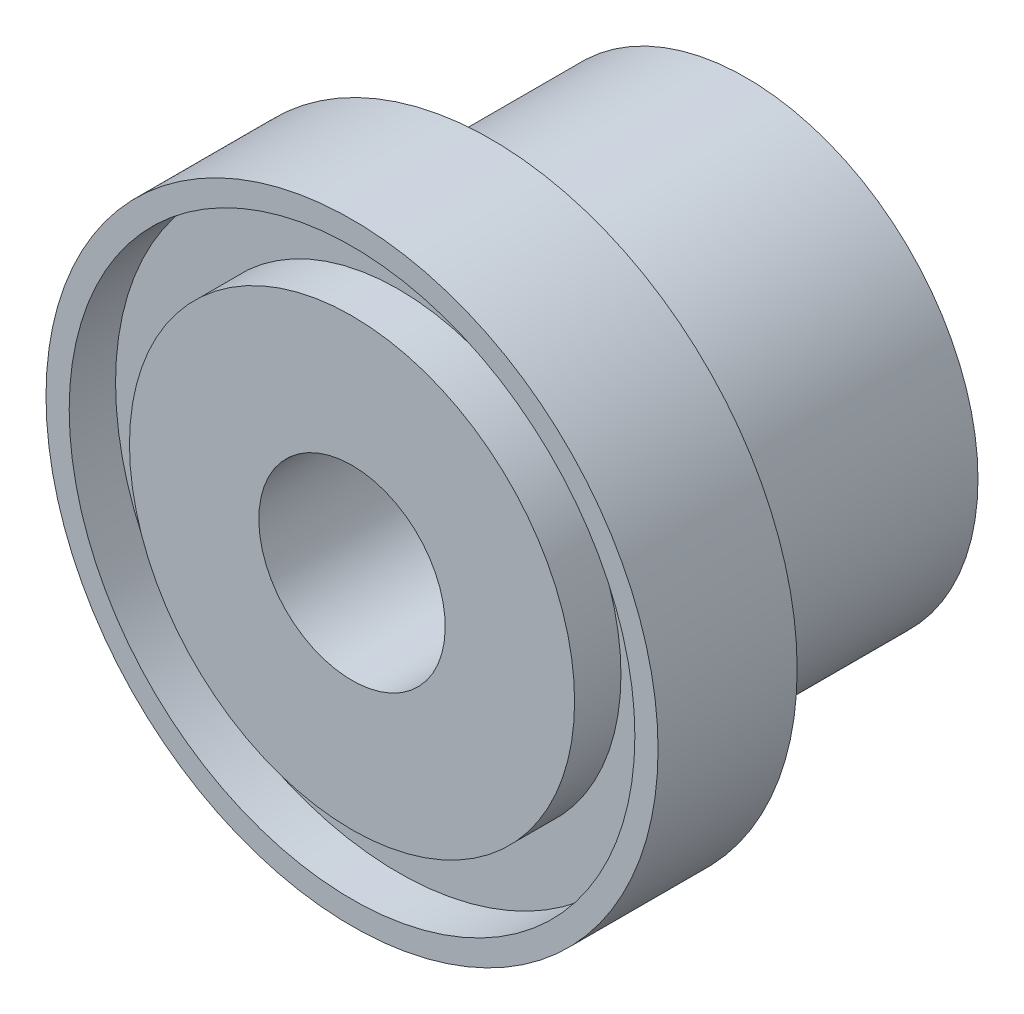
ISO-10303-21;
HEADER;
FILE_DESCRIPTION(('STEP AP214'),'2;1');
FILE_NAME('part.step','',(''),(''),'','','');
FILE_SCHEMA(('AUTOMOTIVE_DESIGN { 1 0 10303 214 1 1 1 1 }'));
ENDSEC;
DATA;
#1=APPLICATION_CONTEXT('core data for automotive mechanical design processes');
#2=APPLICATION_PROTOCOL_DEFINITION('international standard','automotive_design',2000,#1);
#3=PRODUCT_CONTEXT('',#1,'mechanical');
#4=PRODUCT('Part','Part','',(#3));
#5=PRODUCT_RELATED_PRODUCT_CATEGORY('part','',(#4));
#6=PRODUCT_DEFINITION_FORMATION('','',#4);
#7=PRODUCT_DEFINITION_CONTEXT('part definition',#1,'design');
#8=PRODUCT_DEFINITION('design','',#6,#7);
#9=PRODUCT_DEFINITION_SHAPE('','',#8);
#10=(LENGTH_UNIT() NAMED_UNIT(*) SI_UNIT(.MILLI.,.METRE.));
#11=(NAMED_UNIT(*) PLANE_ANGLE_UNIT() SI_UNIT($,.RADIAN.));
#12=(NAMED_UNIT(*) SI_UNIT($,.STERADIAN.) SOLID_ANGLE_UNIT());
#13=UNCERTAINTY_MEASURE_WITH_UNIT(LENGTH_MEASURE(1.E-05),#10,'distance_accuracy_value','');
#14=(GEOMETRIC_REPRESENTATION_CONTEXT(3) GLOBAL_UNCERTAINTY_ASSIGNED_CONTEXT((#13)) GLOBAL_UNIT_ASSIGNED_CONTEXT((#10,
#11,#12)) REPRESENTATION_CONTEXT('',''));
#15=CARTESIAN_POINT('',(0.,0.,0.));
#16=DIRECTION('',(0.,0.,1.));
#17=DIRECTION('',(1.,0.,0.));
#18=AXIS2_PLACEMENT_3D('',#15,#16,#17);
#19=CARTESIAN_POINT('',(43.174261814343,8.55034403189349,3.81));
#20=DIRECTION('',(0.,0.,1.));
#21=DIRECTION('',(1.,0.,0.));
#22=AXIS2_PLACEMENT_3D('',#19,#20,#21);
#23=PLANE('',#22);
#24=CARTESIAN_POINT('',(43.174261814343,8.55034403189349,3.81));
#25=DIRECTION('',(0.,0.,-1.));
#26=DIRECTION('',(0.,1.,0.));
#27=AXIS2_PLACEMENT_3D('',#24,#25,#26);
#28=CIRCLE('',#27,2.5527);
#29=CARTESIAN_POINT('',(43.174261814343,11.1030440318935,3.81));
#30=VERTEX_POINT('',#29);
#31=EDGE_CURVE('E49',#30,#30,#28,.T.);
#32=ORIENTED_EDGE('',*,*,#31,.T.);
#33=EDGE_LOOP('',(#32));
#34=FACE_BOUND('',#33,.T.);
#35=CARTESIAN_POINT('',(43.174261814343,8.55034403189349,3.81));
#36=DIRECTION('',(0.,0.,1.));
#37=DIRECTION('',(1.,0.,0.));
#38=AXIS2_PLACEMENT_3D('',#35,#36,#37);
#39=CIRCLE('',#38,6.09599999999999);
#40=CARTESIAN_POINT('',(49.270261814343,8.55034403189349,3.81));
#41=VERTEX_POINT('',#40);
#42=EDGE_CURVE('E63',#41,#41,#39,.T.);
#43=ORIENTED_EDGE('',*,*,#42,.T.);
#44=EDGE_LOOP('',(#43));
#45=FACE_BOUND('',#44,.T.);
#46=ADVANCED_FACE('F30',(#34,#45),#23,.T.);
#47=CARTESIAN_POINT('',(43.174261814343,8.55034403189349,-24.9455122421383));
#48=DIRECTION('',(0.,0.,1.));
#49=DIRECTION('',(1.,0.,0.));
#50=AXIS2_PLACEMENT_3D('',#47,#48,#49);
#51=CYLINDRICAL_SURFACE('',#50,6.35);
#52=CARTESIAN_POINT('',(43.174261814343,8.55034403189349,-6.985));
#53=DIRECTION('',(0.,0.,1.));
#54=DIRECTION('',(1.,0.,0.));
#55=AXIS2_PLACEMENT_3D('',#52,#53,#54);
#56=CIRCLE('',#55,6.35);
#57=CARTESIAN_POINT('',(49.524261814343,8.55034403189349,-6.985));
#58=VERTEX_POINT('',#57);
#59=EDGE_CURVE('E10',#58,#58,#56,.F.);
#60=ORIENTED_EDGE('',*,*,#59,.F.);
#61=EDGE_LOOP('',(#60));
#62=FACE_BOUND('',#61,.T.);
#63=CARTESIAN_POINT('',(43.174261814343,8.55034403189349,0.));
#64=DIRECTION('',(0.,0.,1.));
#65=DIRECTION('',(1.,0.,0.));
#66=AXIS2_PLACEMENT_3D('',#63,#64,#65);
#67=CIRCLE('',#66,6.35);
#68=CARTESIAN_POINT('',(49.524261814343,8.55034403189349,0.));
#69=VERTEX_POINT('',#68);
#70=EDGE_CURVE('E37',#69,#69,#67,.T.);
#71=ORIENTED_EDGE('',*,*,#70,.F.);
#72=EDGE_LOOP('',(#71));
#73=FACE_BOUND('',#72,.T.);
#74=ADVANCED_FACE('F32',(#62,#73),#51,.T.);
#75=CARTESIAN_POINT('',(49.7443781458071,-19.6475984983234,-6.985));
#76=DIRECTION('',(0.,0.,1.));
#77=DIRECTION('',(0.867132626840089,0.4980773107354,0.));
#78=AXIS2_PLACEMENT_3D('',#75,#76,#77);
#79=PLANE('',#78);
#80=CARTESIAN_POINT('',(43.174261814343,8.55034403189349,-6.985));
#81=DIRECTION('',(0.,0.,-1.));
#82=DIRECTION('',(0.,1.,0.));
#83=AXIS2_PLACEMENT_3D('',#80,#81,#82);
#84=CIRCLE('',#83,2.5527);
#85=CARTESIAN_POINT('',(43.174261814343,11.1030440318935,-6.985));
#86=VERTEX_POINT('',#85);
#87=EDGE_CURVE('E51',#86,#86,#84,.T.);
#88=ORIENTED_EDGE('',*,*,#87,.F.);
#89=EDGE_LOOP('',(#88));
#90=FACE_BOUND('',#89,.T.);
#91=ORIENTED_EDGE('',*,*,#59,.T.);
#92=EDGE_LOOP('',(#91));
#93=FACE_BOUND('',#92,.T.);
#94=ADVANCED_FACE('F95',(#90,#93),#79,.F.);
#95=CARTESIAN_POINT('',(43.174261814343,8.55034403189349,3.81));
#96=DIRECTION('',(0.,0.,-1.));
#97=DIRECTION('',(-1.,0.,0.));
#98=AXIS2_PLACEMENT_3D('',#95,#96,#97);
#99=CYLINDRICAL_SURFACE('',#98,8.382);
#100=CARTESIAN_POINT('',(43.174261814343,8.55034403189349,3.81));
#101=DIRECTION('',(0.,0.,1.));
#102=DIRECTION('',(1.,0.,0.));
#103=AXIS2_PLACEMENT_3D('',#100,#101,#102);
#104=CIRCLE('',#103,8.382);
#105=CARTESIAN_POINT('',(34.792261814343,8.55034403189349,3.81));
#106=VERTEX_POINT('',#105);
#107=EDGE_CURVE('E41',#106,#106,#104,.T.);
#108=CARTESIAN_POINT('',(43.174261814343,8.55034403189349,0.));
#109=DIRECTION('',(0.,0.,1.));
#110=DIRECTION('',(1.,0.,0.));
#111=AXIS2_PLACEMENT_3D('',#108,#109,#110);
#112=CIRCLE('',#111,8.382);
#113=CARTESIAN_POINT('',(34.792261814343,8.55034403189349,0.));
#114=VERTEX_POINT('',#113);
#115=EDGE_CURVE('E45',#114,#114,#112,.T.);
#116=CARTESIAN_POINT('',(34.792261814343,8.55034403189349,3.81));
#117=CARTESIAN_POINT('',(34.792261814343,8.55034403189349,3.7703125));
#118=CARTESIAN_POINT('',(34.792261814343,8.55034403189349,3.730625));
#119=CARTESIAN_POINT('',(34.792261814343,8.55034403189349,3.65125));
#120=CARTESIAN_POINT('',(34.792261814343,8.55034403189349,3.6115625));
#121=CARTESIAN_POINT('',(34.792261814343,8.55034403189349,3.5321875));
#122=CARTESIAN_POINT('',(34.792261814343,8.55034403189349,3.4925));
#123=CARTESIAN_POINT('',(34.792261814343,8.55034403189349,3.413125));
#124=CARTESIAN_POINT('',(34.792261814343,8.55034403189349,3.3734375));
#125=CARTESIAN_POINT('',(34.792261814343,8.55034403189349,3.2940625));
#126=CARTESIAN_POINT('',(34.792261814343,8.55034403189349,3.254375));
#127=CARTESIAN_POINT('',(34.792261814343,8.55034403189349,3.175));
#128=CARTESIAN_POINT('',(34.792261814343,8.55034403189349,3.1353125));
#129=CARTESIAN_POINT('',(34.792261814343,8.55034403189349,3.0559375));
#130=CARTESIAN_POINT('',(34.792261814343,8.55034403189349,3.01625));
#131=CARTESIAN_POINT('',(34.792261814343,8.55034403189349,2.936875));
#132=CARTESIAN_POINT('',(34.792261814343,8.55034403189349,2.8971875));
#133=CARTESIAN_POINT('',(34.792261814343,8.55034403189349,2.8178125));
#134=CARTESIAN_POINT('',(34.792261814343,8.55034403189349,2.778125));
#135=CARTESIAN_POINT('',(34.792261814343,8.55034403189349,2.69875));
#136=CARTESIAN_POINT('',(34.792261814343,8.55034403189349,2.6590625));
#137=CARTESIAN_POINT('',(34.792261814343,8.55034403189349,2.5796875));
#138=CARTESIAN_POINT('',(34.792261814343,8.55034403189349,2.54));
#139=CARTESIAN_POINT('',(34.792261814343,8.55034403189349,2.460625));
#140=CARTESIAN_POINT('',(34.792261814343,8.55034403189349,2.4209375));
#141=CARTESIAN_POINT('',(34.792261814343,8.55034403189349,2.3415625));
#142=CARTESIAN_POINT('',(34.792261814343,8.55034403189349,2.301875));
#143=CARTESIAN_POINT('',(34.792261814343,8.55034403189349,2.2225));
#144=CARTESIAN_POINT('',(34.792261814343,8.55034403189349,2.1828125));
#145=CARTESIAN_POINT('',(34.792261814343,8.55034403189349,2.1034375));
#146=CARTESIAN_POINT('',(34.792261814343,8.55034403189349,2.06375));
#147=CARTESIAN_POINT('',(34.792261814343,8.55034403189349,1.984375));
#148=CARTESIAN_POINT('',(34.792261814343,8.55034403189349,1.9446875));
#149=CARTESIAN_POINT('',(34.792261814343,8.55034403189349,1.8653125));
#150=CARTESIAN_POINT('',(34.792261814343,8.55034403189349,1.825625));
#151=CARTESIAN_POINT('',(34.792261814343,8.55034403189349,1.74625));
#152=CARTESIAN_POINT('',(34.792261814343,8.55034403189349,1.7065625));
#153=CARTESIAN_POINT('',(34.792261814343,8.55034403189349,1.6271875));
#154=CARTESIAN_POINT('',(34.792261814343,8.55034403189349,1.5875));
#155=CARTESIAN_POINT('',(34.792261814343,8.55034403189349,1.508125));
#156=CARTESIAN_POINT('',(34.792261814343,8.55034403189349,1.4684375));
#157=CARTESIAN_POINT('',(34.792261814343,8.55034403189349,1.3890625));
#158=CARTESIAN_POINT('',(34.792261814343,8.55034403189349,1.349375));
#159=CARTESIAN_POINT('',(34.792261814343,8.55034403189349,1.27));
#160=CARTESIAN_POINT('',(34.792261814343,8.55034403189349,1.2303125));
#161=CARTESIAN_POINT('',(34.792261814343,8.55034403189349,1.1509375));
#162=CARTESIAN_POINT('',(34.792261814343,8.55034403189349,1.11125));
#163=CARTESIAN_POINT('',(34.792261814343,8.55034403189349,1.031875));
#164=CARTESIAN_POINT('',(34.792261814343,8.55034403189349,0.9921875));
#165=CARTESIAN_POINT('',(34.792261814343,8.55034403189349,0.9128125));
#166=CARTESIAN_POINT('',(34.792261814343,8.55034403189349,0.873125));
#167=CARTESIAN_POINT('',(34.792261814343,8.55034403189349,0.79375));
#168=CARTESIAN_POINT('',(34.792261814343,8.55034403189349,0.7540625));
#169=CARTESIAN_POINT('',(34.792261814343,8.55034403189349,0.6746875));
#170=CARTESIAN_POINT('',(34.792261814343,8.55034403189349,0.635));
#171=CARTESIAN_POINT('',(34.792261814343,8.55034403189349,0.555625));
#172=CARTESIAN_POINT('',(34.792261814343,8.55034403189349,0.5159375));
#173=CARTESIAN_POINT('',(34.792261814343,8.55034403189349,0.4365625));
#174=CARTESIAN_POINT('',(34.792261814343,8.55034403189349,0.396875));
#175=CARTESIAN_POINT('',(34.792261814343,8.55034403189349,0.3175));
#176=CARTESIAN_POINT('',(34.792261814343,8.55034403189349,0.2778125));
#177=CARTESIAN_POINT('',(34.792261814343,8.55034403189349,0.1984375));
#178=CARTESIAN_POINT('',(34.792261814343,8.55034403189349,0.15875));
#179=CARTESIAN_POINT('',(34.792261814343,8.55034403189349,0.0793749999999999));
#180=CARTESIAN_POINT('',(34.792261814343,8.55034403189349,0.0396874999999999));
#181=CARTESIAN_POINT('',(34.792261814343,8.55034403189349,0.));
#182=B_SPLINE_CURVE_WITH_KNOTS('',3,(#116,#117,#118,#119,#120,#121,#122,#123,#124,#125,#126,
#127,#128,#129,#130,#131,#132,#133,#134,#135,#136,#137,#138,#139,#140,#141,#142,#143,#144,#145,
#146,#147,#148,#149,#150,#151,#152,#153,#154,#155,#156,#157,#158,#159,#160,#161,#162,#163,#164,
#165,#166,#167,#168,#169,#170,#171,#172,#173,#174,#175,#176,#177,#178,#179,#180,#181),
.UNSPECIFIED.,.F.,.F.,(4,2,2,2,2,2,2,2,2,2,2,2,2,2,2,2,2,2,2,2,2,2,2,2,2,2,2,2,2,2,2,2,4),(0.,
0.1190625,0.238125,0.3571875,0.47625,0.595312499999999,0.714375,0.833437499999999,
0.952499999999999,1.0715625,1.190625,1.3096875,1.42875,1.5478125,1.666875,1.7859375,1.905,
2.0240625,2.143125,2.2621875,2.38125,2.5003125,2.619375,2.7384375,2.8575,2.9765625,3.095625,
3.2146875,3.33375,3.4528125,3.571875,3.6909375,3.81),.UNSPECIFIED.);
#183=EDGE_CURVE('BSEAM89',#106,#114,#182,.T.);
#184=ORIENTED_EDGE('',*,*,#107,.F.);
#185=ORIENTED_EDGE('',*,*,#115,.T.);
#186=ORIENTED_EDGE('',*,*,#183,.T.);
#187=ORIENTED_EDGE('',*,*,#183,.F.);
#188=EDGE_LOOP('',(#184,#186,#185,#187));
#189=FACE_BOUND('',#188,.T.);
#190=ADVANCED_FACE('F89',(#189),#99,.T.);
#191=CARTESIAN_POINT('',(43.174261814343,8.55034403189349,3.81));
#192=DIRECTION('',(0.,0.,1.));
#193=DIRECTION('',(1.,0.,0.));
#194=AXIS2_PLACEMENT_3D('',#191,#192,#193);
#195=CIRCLE('',#194,7.747);
#196=CARTESIAN_POINT('',(50.921261814343,8.55034403189349,3.81));
#197=VERTEX_POINT('',#196);
#198=EDGE_CURVE('E57',#197,#197,#195,.T.);
#199=ORIENTED_EDGE('',*,*,#198,.F.);
#200=EDGE_LOOP('',(#199));
#201=FACE_BOUND('',#200,.T.);
#202=ORIENTED_EDGE('',*,*,#107,.T.);
#203=EDGE_LOOP('',(#202));
#204=FACE_BOUND('',#203,.T.);
#205=ADVANCED_FACE('F85',(#201,#204),#23,.T.);
#206=CARTESIAN_POINT('',(43.174261814343,8.55034403189349,0.));
#207=DIRECTION('',(0.,0.,1.));
#208=DIRECTION('',(1.,0.,0.));
#209=AXIS2_PLACEMENT_3D('',#206,#207,#208);
#210=PLANE('',#209);
#211=ORIENTED_EDGE('',*,*,#70,.T.);
#212=EDGE_LOOP('',(#211));
#213=FACE_BOUND('',#212,.T.);
#214=ORIENTED_EDGE('',*,*,#115,.F.);
#215=EDGE_LOOP('',(#214));
#216=FACE_BOUND('',#215,.T.);
#217=ADVANCED_FACE('F88',(#213,#216),#210,.F.);
#218=CARTESIAN_POINT('',(43.174261814343,8.55034403189349,3.81));
#219=DIRECTION('',(0.,0.,-1.));
#220=DIRECTION('',(0.,1.,0.));
#221=AXIS2_PLACEMENT_3D('',#218,#219,#220);
#222=CYLINDRICAL_SURFACE('',#221,2.5527);
#223=ORIENTED_EDGE('',*,*,#31,.F.);
#224=EDGE_LOOP('',(#223));
#225=FACE_BOUND('',#224,.T.);
#226=ORIENTED_EDGE('',*,*,#87,.T.);
#227=EDGE_LOOP('',(#226));
#228=FACE_BOUND('',#227,.T.);
#229=ADVANCED_FACE('F81',(#225,#228),#222,.F.);
#230=CARTESIAN_POINT('',(43.174261814343,8.55034403189349,2.54));
#231=DIRECTION('',(0.,0.,1.));
#232=DIRECTION('',(1.,0.,0.));
#233=AXIS2_PLACEMENT_3D('',#230,#231,#232);
#234=CYLINDRICAL_SURFACE('',#233,7.747);
#235=CARTESIAN_POINT('',(43.174261814343,8.55034403189349,2.54));
#236=DIRECTION('',(0.,0.,1.));
#237=DIRECTION('',(1.,0.,0.));
#238=AXIS2_PLACEMENT_3D('',#235,#236,#237);
#239=CIRCLE('',#238,7.747);
#240=CARTESIAN_POINT('',(50.921261814343,8.55034403189349,2.54));
#241=VERTEX_POINT('',#240);
#242=EDGE_CURVE('E54',#241,#241,#239,.T.);
#243=ORIENTED_EDGE('',*,*,#242,.F.);
#244=EDGE_LOOP('',(#243));
#245=FACE_BOUND('',#244,.T.);
#246=ORIENTED_EDGE('',*,*,#198,.T.);
#247=EDGE_LOOP('',(#246));
#248=FACE_BOUND('',#247,.T.);
#249=ADVANCED_FACE('F75',(#245,#248),#234,.F.);
#250=CARTESIAN_POINT('',(43.174261814343,8.55034403189349,2.54));
#251=DIRECTION('',(0.,0.,1.));
#252=DIRECTION('',(1.,0.,0.));
#253=AXIS2_PLACEMENT_3D('',#250,#251,#252);
#254=PLANE('',#253);
#255=CARTESIAN_POINT('',(43.174261814343,8.55034403189349,2.54));
#256=DIRECTION('',(0.,0.,1.));
#257=DIRECTION('',(1.,0.,0.));
#258=AXIS2_PLACEMENT_3D('',#255,#256,#257);
#259=CIRCLE('',#258,6.09599999999999);
#260=CARTESIAN_POINT('',(49.270261814343,8.55034403189349,2.54));
#261=VERTEX_POINT('',#260);
#262=EDGE_CURVE('E60',#261,#261,#259,.T.);
#263=ORIENTED_EDGE('',*,*,#262,.F.);
#264=EDGE_LOOP('',(#263));
#265=FACE_BOUND('',#264,.T.);
#266=ORIENTED_EDGE('',*,*,#242,.T.);
#267=EDGE_LOOP('',(#266));
#268=FACE_BOUND('',#267,.T.);
#269=ADVANCED_FACE('F72',(#265,#268),#254,.T.);
#270=CARTESIAN_POINT('',(43.174261814343,8.55034403189349,2.54));
#271=DIRECTION('',(0.,0.,1.));
#272=DIRECTION('',(1.,0.,0.));
#273=AXIS2_PLACEMENT_3D('',#270,#271,#272);
#274=CYLINDRICAL_SURFACE('',#273,6.09599999999999);
#275=ORIENTED_EDGE('',*,*,#262,.T.);
#276=EDGE_LOOP('',(#275));
#277=FACE_BOUND('',#276,.T.);
#278=ORIENTED_EDGE('',*,*,#42,.F.);
#279=EDGE_LOOP('',(#278));
#280=FACE_BOUND('',#279,.T.);
#281=ADVANCED_FACE('F69',(#277,#280),#274,.T.);
#282=CLOSED_SHELL('',(#46,#74,#94,#190,#205,#217,#229,#249,#269,#281));
#283=MANIFOLD_SOLID_BREP('B2',#282);
#284=ADVANCED_BREP_SHAPE_REPRESENTATION('',(#18,#283),#14);
#285=SHAPE_DEFINITION_REPRESENTATION(#9,#284);
ENDSEC;
END-ISO-10303-21;
